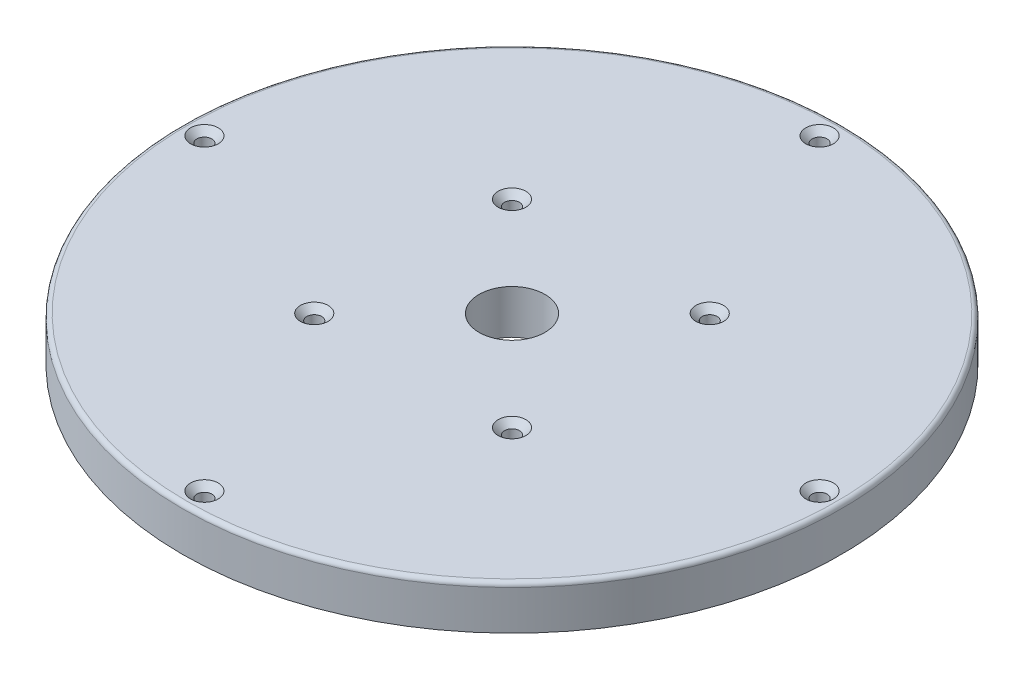
ISO-10303-21;
HEADER;
FILE_DESCRIPTION(('STEP AP214'),'2;1');
FILE_NAME('part.step','',(''),(''),'','','');
FILE_SCHEMA(('AUTOMOTIVE_DESIGN { 1 0 10303 214 1 1 1 1 }'));
ENDSEC;
DATA;
#1=APPLICATION_CONTEXT('core data for automotive mechanical design processes');
#2=APPLICATION_PROTOCOL_DEFINITION('international standard','automotive_design',2000,#1);
#3=PRODUCT_CONTEXT('',#1,'mechanical');
#4=PRODUCT('Part','Part','',(#3));
#5=PRODUCT_RELATED_PRODUCT_CATEGORY('part','',(#4));
#6=PRODUCT_DEFINITION_FORMATION('','',#4);
#7=PRODUCT_DEFINITION_CONTEXT('part definition',#1,'design');
#8=PRODUCT_DEFINITION('design','',#6,#7);
#9=PRODUCT_DEFINITION_SHAPE('','',#8);
#10=(LENGTH_UNIT() NAMED_UNIT(*) SI_UNIT(.MILLI.,.METRE.));
#11=(NAMED_UNIT(*) PLANE_ANGLE_UNIT() SI_UNIT($,.RADIAN.));
#12=(NAMED_UNIT(*) SI_UNIT($,.STERADIAN.) SOLID_ANGLE_UNIT());
#13=UNCERTAINTY_MEASURE_WITH_UNIT(LENGTH_MEASURE(1.E-05),#10,'distance_accuracy_value','');
#14=(GEOMETRIC_REPRESENTATION_CONTEXT(3) GLOBAL_UNCERTAINTY_ASSIGNED_CONTEXT((#13)) GLOBAL_UNIT_ASSIGNED_CONTEXT((#10,
#11,#12)) REPRESENTATION_CONTEXT('',''));
#15=CARTESIAN_POINT('',(0.,0.,0.));
#16=DIRECTION('',(0.,0.,1.));
#17=DIRECTION('',(1.,0.,0.));
#18=AXIS2_PLACEMENT_3D('',#15,#16,#17);
#19=CARTESIAN_POINT('',(0.,10.,0.));
#20=DIRECTION('',(0.,-1.,0.));
#21=DIRECTION('',(0.,0.,-1.));
#22=AXIS2_PLACEMENT_3D('',#19,#20,#21);
#23=CYLINDRICAL_SURFACE('',#22,75.);
#24=CARTESIAN_POINT('',(0.,9.,0.));
#25=DIRECTION('',(0.,1.,0.));
#26=DIRECTION('',(0.,0.,1.));
#27=AXIS2_PLACEMENT_3D('',#24,#25,#26);
#28=CIRCLE('',#27,75.);
#29=CARTESIAN_POINT('',(0.,9.,75.));
#30=VERTEX_POINT('',#29);
#31=EDGE_CURVE('E10',#30,#30,#28,.F.);
#32=ORIENTED_EDGE('',*,*,#31,.T.);
#33=EDGE_LOOP('',(#32));
#34=FACE_BOUND('',#33,.T.);
#35=CARTESIAN_POINT('',(0.,0.,0.));
#36=DIRECTION('',(0.,1.,0.));
#37=DIRECTION('',(0.,0.,1.));
#38=AXIS2_PLACEMENT_3D('',#35,#36,#37);
#39=CIRCLE('',#38,75.);
#40=CARTESIAN_POINT('',(0.,0.,75.));
#41=VERTEX_POINT('',#40);
#42=EDGE_CURVE('E45',#41,#41,#39,.T.);
#43=ORIENTED_EDGE('',*,*,#42,.T.);
#44=EDGE_LOOP('',(#43));
#45=FACE_BOUND('',#44,.T.);
#46=ADVANCED_FACE('F34',(#34,#45),#23,.T.);
#47=CARTESIAN_POINT('',(0.,10.,0.));
#48=DIRECTION('',(0.,1.,0.));
#49=DIRECTION('',(0.,0.,1.));
#50=AXIS2_PLACEMENT_3D('',#47,#48,#49);
#51=PLANE('',#50);
#52=CARTESIAN_POINT('',(0.,10.,0.));
#53=DIRECTION('',(0.,1.,0.));
#54=DIRECTION('',(0.,0.,1.));
#55=AXIS2_PLACEMENT_3D('',#52,#53,#54);
#56=CIRCLE('',#55,74.);
#57=CARTESIAN_POINT('',(0.,10.,74.));
#58=VERTEX_POINT('',#57);
#59=EDGE_CURVE('E41',#58,#58,#56,.T.);
#60=ORIENTED_EDGE('',*,*,#59,.T.);
#61=EDGE_LOOP('',(#60));
#62=FACE_BOUND('',#61,.T.);
#63=CARTESIAN_POINT('',(22.5,10.,-22.5));
#64=DIRECTION('',(0.,1.,0.));
#65=DIRECTION('',(0.,0.,1.));
#66=AXIS2_PLACEMENT_3D('',#63,#64,#65);
#67=CIRCLE('',#66,3.15);
#68=CARTESIAN_POINT('',(22.5,10.,-19.35));
#69=VERTEX_POINT('',#68);
#70=EDGE_CURVE('E126',#69,#69,#67,.T.);
#71=ORIENTED_EDGE('',*,*,#70,.F.);
#72=EDGE_LOOP('',(#71));
#73=FACE_BOUND('',#72,.T.);
#74=CARTESIAN_POINT('',(22.5,10.,22.5));
#75=DIRECTION('',(0.,1.,0.));
#76=DIRECTION('',(0.,0.,1.));
#77=AXIS2_PLACEMENT_3D('',#74,#75,#76);
#78=CIRCLE('',#77,3.15);
#79=CARTESIAN_POINT('',(22.5,10.,25.65));
#80=VERTEX_POINT('',#79);
#81=EDGE_CURVE('E117',#80,#80,#78,.T.);
#82=ORIENTED_EDGE('',*,*,#81,.F.);
#83=EDGE_LOOP('',(#82));
#84=FACE_BOUND('',#83,.T.);
#85=CARTESIAN_POINT('',(-22.5,10.,22.5));
#86=DIRECTION('',(0.,1.,0.));
#87=DIRECTION('',(0.,0.,1.));
#88=AXIS2_PLACEMENT_3D('',#85,#86,#87);
#89=CIRCLE('',#88,3.15);
#90=CARTESIAN_POINT('',(-22.5,10.,25.65));
#91=VERTEX_POINT('',#90);
#92=EDGE_CURVE('E108',#91,#91,#89,.T.);
#93=ORIENTED_EDGE('',*,*,#92,.F.);
#94=EDGE_LOOP('',(#93));
#95=FACE_BOUND('',#94,.T.);
#96=CARTESIAN_POINT('',(-22.5,10.,-22.5));
#97=DIRECTION('',(0.,1.,0.));
#98=DIRECTION('',(0.,0.,1.));
#99=AXIS2_PLACEMENT_3D('',#96,#97,#98);
#100=CIRCLE('',#99,3.15);
#101=CARTESIAN_POINT('',(-22.5,10.,-19.35));
#102=VERTEX_POINT('',#101);
#103=EDGE_CURVE('E99',#102,#102,#100,.T.);
#104=ORIENTED_EDGE('',*,*,#103,.F.);
#105=EDGE_LOOP('',(#104));
#106=FACE_BOUND('',#105,.T.);
#107=CARTESIAN_POINT('',(0.,10.,0.));
#108=DIRECTION('',(0.,1.,0.));
#109=DIRECTION('',(0.,0.,1.));
#110=AXIS2_PLACEMENT_3D('',#107,#108,#109);
#111=CIRCLE('',#110,7.5);
#112=CARTESIAN_POINT('',(0.,10.,7.5));
#113=VERTEX_POINT('',#112);
#114=EDGE_CURVE('E88',#113,#113,#111,.T.);
#115=ORIENTED_EDGE('',*,*,#114,.F.);
#116=EDGE_LOOP('',(#115));
#117=FACE_BOUND('',#116,.T.);
#118=CARTESIAN_POINT('',(70.,10.,-7.33211081157058E-13));
#119=DIRECTION('',(0.,1.,0.));
#120=DIRECTION('',(0.,0.,1.));
#121=AXIS2_PLACEMENT_3D('',#118,#119,#120);
#122=CIRCLE('',#121,3.15);
#123=CARTESIAN_POINT('',(70.,10.,3.14999999999927));
#124=VERTEX_POINT('',#123);
#125=EDGE_CURVE('E84',#124,#124,#122,.T.);
#126=ORIENTED_EDGE('',*,*,#125,.F.);
#127=EDGE_LOOP('',(#126));
#128=FACE_BOUND('',#127,.T.);
#129=CARTESIAN_POINT('',(0.,10.,70.));
#130=DIRECTION('',(0.,1.,0.));
#131=DIRECTION('',(0.,0.,1.));
#132=AXIS2_PLACEMENT_3D('',#129,#130,#131);
#133=CIRCLE('',#132,3.15);
#134=CARTESIAN_POINT('',(0.,10.,73.15));
#135=VERTEX_POINT('',#134);
#136=EDGE_CURVE('E75',#135,#135,#133,.T.);
#137=ORIENTED_EDGE('',*,*,#136,.F.);
#138=EDGE_LOOP('',(#137));
#139=FACE_BOUND('',#138,.T.);
#140=CARTESIAN_POINT('',(-70.,10.,2.44403693719019E-13));
#141=DIRECTION('',(0.,1.,0.));
#142=DIRECTION('',(0.,0.,1.));
#143=AXIS2_PLACEMENT_3D('',#140,#141,#142);
#144=CIRCLE('',#143,3.15);
#145=CARTESIAN_POINT('',(-70.,10.,3.15000000000024));
#146=VERTEX_POINT('',#145);
#147=EDGE_CURVE('E66',#146,#146,#144,.T.);
#148=ORIENTED_EDGE('',*,*,#147,.F.);
#149=EDGE_LOOP('',(#148));
#150=FACE_BOUND('',#149,.T.);
#151=CARTESIAN_POINT('',(0.,10.,-70.));
#152=DIRECTION('',(0.,1.,0.));
#153=DIRECTION('',(0.,0.,1.));
#154=AXIS2_PLACEMENT_3D('',#151,#152,#153);
#155=CIRCLE('',#154,3.15);
#156=CARTESIAN_POINT('',(0.,10.,-66.85));
#157=VERTEX_POINT('',#156);
#158=EDGE_CURVE('E57',#157,#157,#155,.T.);
#159=ORIENTED_EDGE('',*,*,#158,.F.);
#160=EDGE_LOOP('',(#159));
#161=FACE_BOUND('',#160,.T.);
#162=ADVANCED_FACE('F132',(#62,#73,#84,#95,#106,#117,#128,#139,#150,#161),#51,.T.);
#163=CARTESIAN_POINT('',(0.,0.,0.));
#164=DIRECTION('',(0.,1.,0.));
#165=DIRECTION('',(0.,0.,1.));
#166=AXIS2_PLACEMENT_3D('',#163,#164,#165);
#167=PLANE('',#166);
#168=CARTESIAN_POINT('',(22.5,0.,-22.5));
#169=DIRECTION('',(0.,1.,0.));
#170=DIRECTION('',(0.,0.,1.));
#171=AXIS2_PLACEMENT_3D('',#168,#169,#170);
#172=CIRCLE('',#171,1.69999999999999);
#173=CARTESIAN_POINT('',(22.5,0.,-20.8));
#174=VERTEX_POINT('',#173);
#175=EDGE_CURVE('E120',#174,#174,#172,.T.);
#176=ORIENTED_EDGE('',*,*,#175,.T.);
#177=EDGE_LOOP('',(#176));
#178=FACE_BOUND('',#177,.T.);
#179=CARTESIAN_POINT('',(22.5,0.,22.5));
#180=DIRECTION('',(0.,1.,0.));
#181=DIRECTION('',(0.,0.,1.));
#182=AXIS2_PLACEMENT_3D('',#179,#180,#181);
#183=CIRCLE('',#182,1.69999999999999);
#184=CARTESIAN_POINT('',(22.5,0.,24.2));
#185=VERTEX_POINT('',#184);
#186=EDGE_CURVE('E111',#185,#185,#183,.T.);
#187=ORIENTED_EDGE('',*,*,#186,.T.);
#188=EDGE_LOOP('',(#187));
#189=FACE_BOUND('',#188,.T.);
#190=CARTESIAN_POINT('',(-22.5,0.,22.5));
#191=DIRECTION('',(0.,1.,0.));
#192=DIRECTION('',(0.,0.,1.));
#193=AXIS2_PLACEMENT_3D('',#190,#191,#192);
#194=CIRCLE('',#193,1.69999999999999);
#195=CARTESIAN_POINT('',(-22.5,0.,24.2));
#196=VERTEX_POINT('',#195);
#197=EDGE_CURVE('E102',#196,#196,#194,.T.);
#198=ORIENTED_EDGE('',*,*,#197,.T.);
#199=EDGE_LOOP('',(#198));
#200=FACE_BOUND('',#199,.T.);
#201=CARTESIAN_POINT('',(-22.5,0.,-22.5));
#202=DIRECTION('',(0.,1.,0.));
#203=DIRECTION('',(0.,0.,1.));
#204=AXIS2_PLACEMENT_3D('',#201,#202,#203);
#205=CIRCLE('',#204,1.69999999999999);
#206=CARTESIAN_POINT('',(-22.5,0.,-20.8));
#207=VERTEX_POINT('',#206);
#208=EDGE_CURVE('E91',#207,#207,#205,.T.);
#209=ORIENTED_EDGE('',*,*,#208,.T.);
#210=EDGE_LOOP('',(#209));
#211=FACE_BOUND('',#210,.T.);
#212=CARTESIAN_POINT('',(0.,0.,0.));
#213=DIRECTION('',(0.,1.,0.));
#214=DIRECTION('',(0.,0.,1.));
#215=AXIS2_PLACEMENT_3D('',#212,#213,#214);
#216=CIRCLE('',#215,7.5);
#217=CARTESIAN_POINT('',(0.,0.,7.5));
#218=VERTEX_POINT('',#217);
#219=EDGE_CURVE('E87',#218,#218,#216,.T.);
#220=ORIENTED_EDGE('',*,*,#219,.T.);
#221=EDGE_LOOP('',(#220));
#222=FACE_BOUND('',#221,.T.);
#223=CARTESIAN_POINT('',(70.,0.,-7.33211081157058E-13));
#224=DIRECTION('',(0.,1.,0.));
#225=DIRECTION('',(0.,0.,1.));
#226=AXIS2_PLACEMENT_3D('',#223,#224,#225);
#227=CIRCLE('',#226,1.69999999999999);
#228=CARTESIAN_POINT('',(70.,0.,1.69999999999926));
#229=VERTEX_POINT('',#228);
#230=EDGE_CURVE('E78',#229,#229,#227,.T.);
#231=ORIENTED_EDGE('',*,*,#230,.T.);
#232=EDGE_LOOP('',(#231));
#233=FACE_BOUND('',#232,.T.);
#234=CARTESIAN_POINT('',(0.,0.,70.));
#235=DIRECTION('',(0.,1.,0.));
#236=DIRECTION('',(0.,0.,1.));
#237=AXIS2_PLACEMENT_3D('',#234,#235,#236);
#238=CIRCLE('',#237,1.7);
#239=CARTESIAN_POINT('',(0.,0.,71.7));
#240=VERTEX_POINT('',#239);
#241=EDGE_CURVE('E69',#240,#240,#238,.T.);
#242=ORIENTED_EDGE('',*,*,#241,.T.);
#243=EDGE_LOOP('',(#242));
#244=FACE_BOUND('',#243,.T.);
#245=CARTESIAN_POINT('',(-70.,0.,2.44403693719019E-13));
#246=DIRECTION('',(0.,1.,0.));
#247=DIRECTION('',(0.,0.,1.));
#248=AXIS2_PLACEMENT_3D('',#245,#246,#247);
#249=CIRCLE('',#248,1.69999999999999);
#250=CARTESIAN_POINT('',(-70.,0.,1.70000000000024));
#251=VERTEX_POINT('',#250);
#252=EDGE_CURVE('E60',#251,#251,#249,.T.);
#253=ORIENTED_EDGE('',*,*,#252,.T.);
#254=EDGE_LOOP('',(#253));
#255=FACE_BOUND('',#254,.T.);
#256=CARTESIAN_POINT('',(0.,0.,-70.));
#257=DIRECTION('',(0.,1.,0.));
#258=DIRECTION('',(0.,0.,1.));
#259=AXIS2_PLACEMENT_3D('',#256,#257,#258);
#260=CIRCLE('',#259,1.7);
#261=CARTESIAN_POINT('',(0.,0.,-68.3));
#262=VERTEX_POINT('',#261);
#263=EDGE_CURVE('E49',#262,#262,#260,.T.);
#264=ORIENTED_EDGE('',*,*,#263,.T.);
#265=EDGE_LOOP('',(#264));
#266=FACE_BOUND('',#265,.T.);
#267=ORIENTED_EDGE('',*,*,#42,.F.);
#268=EDGE_LOOP('',(#267));
#269=FACE_BOUND('',#268,.T.);
#270=ADVANCED_FACE('F135',(#178,#189,#200,#211,#222,#233,#244,#255,#266,#269),#167,.F.);
#271=CARTESIAN_POINT('',(0.,10.,-70.));
#272=DIRECTION('',(0.,1.,0.));
#273=DIRECTION('',(0.,0.,1.));
#274=AXIS2_PLACEMENT_3D('',#271,#272,#273);
#275=CYLINDRICAL_SURFACE('',#274,1.7);
#276=ORIENTED_EDGE('',*,*,#263,.F.);
#277=EDGE_LOOP('',(#276));
#278=FACE_BOUND('',#277,.T.);
#279=CARTESIAN_POINT('',(0.,8.55,-70.));
#280=DIRECTION('',(0.,1.,0.));
#281=DIRECTION('',(0.,0.,1.));
#282=AXIS2_PLACEMENT_3D('',#279,#280,#281);
#283=CIRCLE('',#282,1.7);
#284=CARTESIAN_POINT('',(0.,8.55,-68.3));
#285=VERTEX_POINT('',#284);
#286=EDGE_CURVE('E54',#285,#285,#283,.T.);
#287=ORIENTED_EDGE('',*,*,#286,.T.);
#288=EDGE_LOOP('',(#287));
#289=FACE_BOUND('',#288,.T.);
#290=ADVANCED_FACE('F156',(#278,#289),#275,.F.);
#291=CARTESIAN_POINT('',(0.,10.,-70.));
#292=DIRECTION('',(0.,1.,0.));
#293=DIRECTION('',(0.,0.,1.));
#294=AXIS2_PLACEMENT_3D('',#291,#292,#293);
#295=CONICAL_SURFACE('',#294,3.15,0.785398163397448);
#296=ORIENTED_EDGE('',*,*,#286,.F.);
#297=EDGE_LOOP('',(#296));
#298=FACE_BOUND('',#297,.T.);
#299=ORIENTED_EDGE('',*,*,#158,.T.);
#300=EDGE_LOOP('',(#299));
#301=FACE_BOUND('',#300,.T.);
#302=ADVANCED_FACE('F153',(#298,#301),#295,.F.);
#303=CARTESIAN_POINT('',(-70.,10.,2.44403693719019E-13));
#304=DIRECTION('',(0.,1.,0.));
#305=DIRECTION('',(0.,0.,1.));
#306=AXIS2_PLACEMENT_3D('',#303,#304,#305);
#307=CYLINDRICAL_SURFACE('',#306,1.69999999999999);
#308=ORIENTED_EDGE('',*,*,#252,.F.);
#309=EDGE_LOOP('',(#308));
#310=FACE_BOUND('',#309,.T.);
#311=CARTESIAN_POINT('',(-70.,8.55,2.44403693719019E-13));
#312=DIRECTION('',(0.,1.,0.));
#313=DIRECTION('',(0.,0.,1.));
#314=AXIS2_PLACEMENT_3D('',#311,#312,#313);
#315=CIRCLE('',#314,1.69999999999999);
#316=CARTESIAN_POINT('',(-70.,8.55,1.70000000000024));
#317=VERTEX_POINT('',#316);
#318=EDGE_CURVE('E63',#317,#317,#315,.T.);
#319=ORIENTED_EDGE('',*,*,#318,.T.);
#320=EDGE_LOOP('',(#319));
#321=FACE_BOUND('',#320,.T.);
#322=ADVANCED_FACE('F155',(#310,#321),#307,.F.);
#323=CARTESIAN_POINT('',(-70.,10.,2.44403693719019E-13));
#324=DIRECTION('',(0.,1.,0.));
#325=DIRECTION('',(0.,0.,1.));
#326=AXIS2_PLACEMENT_3D('',#323,#324,#325);
#327=CONICAL_SURFACE('',#326,3.15,0.78539816339745);
#328=ORIENTED_EDGE('',*,*,#318,.F.);
#329=EDGE_LOOP('',(#328));
#330=FACE_BOUND('',#329,.T.);
#331=ORIENTED_EDGE('',*,*,#147,.T.);
#332=EDGE_LOOP('',(#331));
#333=FACE_BOUND('',#332,.T.);
#334=ADVANCED_FACE('F163',(#330,#333),#327,.F.);
#335=CARTESIAN_POINT('',(0.,10.,70.));
#336=DIRECTION('',(0.,1.,0.));
#337=DIRECTION('',(0.,0.,1.));
#338=AXIS2_PLACEMENT_3D('',#335,#336,#337);
#339=CYLINDRICAL_SURFACE('',#338,1.7);
#340=ORIENTED_EDGE('',*,*,#241,.F.);
#341=EDGE_LOOP('',(#340));
#342=FACE_BOUND('',#341,.T.);
#343=CARTESIAN_POINT('',(0.,8.55,70.));
#344=DIRECTION('',(0.,1.,0.));
#345=DIRECTION('',(0.,0.,1.));
#346=AXIS2_PLACEMENT_3D('',#343,#344,#345);
#347=CIRCLE('',#346,1.7);
#348=CARTESIAN_POINT('',(0.,8.55,71.7));
#349=VERTEX_POINT('',#348);
#350=EDGE_CURVE('E72',#349,#349,#347,.T.);
#351=ORIENTED_EDGE('',*,*,#350,.T.);
#352=EDGE_LOOP('',(#351));
#353=FACE_BOUND('',#352,.T.);
#354=ADVANCED_FACE('F203',(#342,#353),#339,.F.);
#355=CARTESIAN_POINT('',(0.,10.,70.));
#356=DIRECTION('',(0.,1.,0.));
#357=DIRECTION('',(0.,0.,1.));
#358=AXIS2_PLACEMENT_3D('',#355,#356,#357);
#359=CONICAL_SURFACE('',#358,3.15,0.785398163397448);
#360=ORIENTED_EDGE('',*,*,#350,.F.);
#361=EDGE_LOOP('',(#360));
#362=FACE_BOUND('',#361,.T.);
#363=ORIENTED_EDGE('',*,*,#136,.T.);
#364=EDGE_LOOP('',(#363));
#365=FACE_BOUND('',#364,.T.);
#366=ADVANCED_FACE('F208',(#362,#365),#359,.F.);
#367=CARTESIAN_POINT('',(70.,10.,-7.33211081157058E-13));
#368=DIRECTION('',(0.,1.,0.));
#369=DIRECTION('',(0.,0.,1.));
#370=AXIS2_PLACEMENT_3D('',#367,#368,#369);
#371=CYLINDRICAL_SURFACE('',#370,1.69999999999999);
#372=ORIENTED_EDGE('',*,*,#230,.F.);
#373=EDGE_LOOP('',(#372));
#374=FACE_BOUND('',#373,.T.);
#375=CARTESIAN_POINT('',(70.,8.55,-7.33211081157058E-13));
#376=DIRECTION('',(0.,1.,0.));
#377=DIRECTION('',(0.,0.,1.));
#378=AXIS2_PLACEMENT_3D('',#375,#376,#377);
#379=CIRCLE('',#378,1.69999999999999);
#380=CARTESIAN_POINT('',(70.,8.55,1.69999999999926));
#381=VERTEX_POINT('',#380);
#382=EDGE_CURVE('E81',#381,#381,#379,.T.);
#383=ORIENTED_EDGE('',*,*,#382,.T.);
#384=EDGE_LOOP('',(#383));
#385=FACE_BOUND('',#384,.T.);
#386=ADVANCED_FACE('F214',(#374,#385),#371,.F.);
#387=CARTESIAN_POINT('',(70.,10.,-7.33211081157058E-13));
#388=DIRECTION('',(0.,1.,0.));
#389=DIRECTION('',(0.,0.,1.));
#390=AXIS2_PLACEMENT_3D('',#387,#388,#389);
#391=CONICAL_SURFACE('',#390,3.15,0.78539816339745);
#392=ORIENTED_EDGE('',*,*,#382,.F.);
#393=EDGE_LOOP('',(#392));
#394=FACE_BOUND('',#393,.T.);
#395=ORIENTED_EDGE('',*,*,#125,.T.);
#396=EDGE_LOOP('',(#395));
#397=FACE_BOUND('',#396,.T.);
#398=ADVANCED_FACE('F218',(#394,#397),#391,.F.);
#399=CARTESIAN_POINT('',(0.,0.,0.));
#400=DIRECTION('',(0.,1.,0.));
#401=DIRECTION('',(0.,0.,1.));
#402=AXIS2_PLACEMENT_3D('',#399,#400,#401);
#403=CYLINDRICAL_SURFACE('',#402,7.5);
#404=ORIENTED_EDGE('',*,*,#219,.F.);
#405=EDGE_LOOP('',(#404));
#406=FACE_BOUND('',#405,.T.);
#407=ORIENTED_EDGE('',*,*,#114,.T.);
#408=EDGE_LOOP('',(#407));
#409=FACE_BOUND('',#408,.T.);
#410=ADVANCED_FACE('F222',(#406,#409),#403,.F.);
#411=CARTESIAN_POINT('',(-22.5,10.,-22.5));
#412=DIRECTION('',(0.,1.,0.));
#413=DIRECTION('',(0.,0.,1.));
#414=AXIS2_PLACEMENT_3D('',#411,#412,#413);
#415=CYLINDRICAL_SURFACE('',#414,1.69999999999999);
#416=ORIENTED_EDGE('',*,*,#208,.F.);
#417=EDGE_LOOP('',(#416));
#418=FACE_BOUND('',#417,.T.);
#419=CARTESIAN_POINT('',(-22.5,8.54999999999999,-22.5));
#420=DIRECTION('',(0.,1.,0.));
#421=DIRECTION('',(0.,0.,1.));
#422=AXIS2_PLACEMENT_3D('',#419,#420,#421);
#423=CIRCLE('',#422,1.69999999999999);
#424=CARTESIAN_POINT('',(-22.5,8.54999999999999,-20.8));
#425=VERTEX_POINT('',#424);
#426=EDGE_CURVE('E96',#425,#425,#423,.T.);
#427=ORIENTED_EDGE('',*,*,#426,.T.);
#428=EDGE_LOOP('',(#427));
#429=FACE_BOUND('',#428,.T.);
#430=ADVANCED_FACE('F226',(#418,#429),#415,.F.);
#431=CARTESIAN_POINT('',(-22.5,10.,-22.5));
#432=DIRECTION('',(0.,1.,0.));
#433=DIRECTION('',(0.,0.,1.));
#434=AXIS2_PLACEMENT_3D('',#431,#432,#433);
#435=CONICAL_SURFACE('',#434,3.15,0.78539816339745);
#436=ORIENTED_EDGE('',*,*,#426,.F.);
#437=EDGE_LOOP('',(#436));
#438=FACE_BOUND('',#437,.T.);
#439=ORIENTED_EDGE('',*,*,#103,.T.);
#440=EDGE_LOOP('',(#439));
#441=FACE_BOUND('',#440,.T.);
#442=ADVANCED_FACE('F230',(#438,#441),#435,.F.);
#443=CARTESIAN_POINT('',(-22.5,10.,22.5));
#444=DIRECTION('',(0.,1.,0.));
#445=DIRECTION('',(0.,0.,1.));
#446=AXIS2_PLACEMENT_3D('',#443,#444,#445);
#447=CYLINDRICAL_SURFACE('',#446,1.69999999999999);
#448=ORIENTED_EDGE('',*,*,#197,.F.);
#449=EDGE_LOOP('',(#448));
#450=FACE_BOUND('',#449,.T.);
#451=CARTESIAN_POINT('',(-22.5,8.54999999999999,22.5));
#452=DIRECTION('',(0.,1.,0.));
#453=DIRECTION('',(0.,0.,1.));
#454=AXIS2_PLACEMENT_3D('',#451,#452,#453);
#455=CIRCLE('',#454,1.69999999999999);
#456=CARTESIAN_POINT('',(-22.5,8.54999999999999,24.2));
#457=VERTEX_POINT('',#456);
#458=EDGE_CURVE('E105',#457,#457,#455,.T.);
#459=ORIENTED_EDGE('',*,*,#458,.T.);
#460=EDGE_LOOP('',(#459));
#461=FACE_BOUND('',#460,.T.);
#462=ADVANCED_FACE('F234',(#450,#461),#447,.F.);
#463=CARTESIAN_POINT('',(-22.5,10.,22.5));
#464=DIRECTION('',(0.,1.,0.));
#465=DIRECTION('',(0.,0.,1.));
#466=AXIS2_PLACEMENT_3D('',#463,#464,#465);
#467=CONICAL_SURFACE('',#466,3.15,0.78539816339745);
#468=ORIENTED_EDGE('',*,*,#458,.F.);
#469=EDGE_LOOP('',(#468));
#470=FACE_BOUND('',#469,.T.);
#471=ORIENTED_EDGE('',*,*,#92,.T.);
#472=EDGE_LOOP('',(#471));
#473=FACE_BOUND('',#472,.T.);
#474=ADVANCED_FACE('F238',(#470,#473),#467,.F.);
#475=CARTESIAN_POINT('',(22.5,10.,22.5));
#476=DIRECTION('',(0.,1.,0.));
#477=DIRECTION('',(0.,0.,1.));
#478=AXIS2_PLACEMENT_3D('',#475,#476,#477);
#479=CYLINDRICAL_SURFACE('',#478,1.69999999999999);
#480=ORIENTED_EDGE('',*,*,#186,.F.);
#481=EDGE_LOOP('',(#480));
#482=FACE_BOUND('',#481,.T.);
#483=CARTESIAN_POINT('',(22.5,8.54999999999999,22.5));
#484=DIRECTION('',(0.,1.,0.));
#485=DIRECTION('',(0.,0.,1.));
#486=AXIS2_PLACEMENT_3D('',#483,#484,#485);
#487=CIRCLE('',#486,1.69999999999999);
#488=CARTESIAN_POINT('',(22.5,8.54999999999999,24.2));
#489=VERTEX_POINT('',#488);
#490=EDGE_CURVE('E114',#489,#489,#487,.T.);
#491=ORIENTED_EDGE('',*,*,#490,.T.);
#492=EDGE_LOOP('',(#491));
#493=FACE_BOUND('',#492,.T.);
#494=ADVANCED_FACE('F242',(#482,#493),#479,.F.);
#495=CARTESIAN_POINT('',(22.5,10.,22.5));
#496=DIRECTION('',(0.,1.,0.));
#497=DIRECTION('',(0.,0.,1.));
#498=AXIS2_PLACEMENT_3D('',#495,#496,#497);
#499=CONICAL_SURFACE('',#498,3.15,0.78539816339745);
#500=ORIENTED_EDGE('',*,*,#490,.F.);
#501=EDGE_LOOP('',(#500));
#502=FACE_BOUND('',#501,.T.);
#503=ORIENTED_EDGE('',*,*,#81,.T.);
#504=EDGE_LOOP('',(#503));
#505=FACE_BOUND('',#504,.T.);
#506=ADVANCED_FACE('F246',(#502,#505),#499,.F.);
#507=CARTESIAN_POINT('',(22.5,10.,-22.5));
#508=DIRECTION('',(0.,1.,0.));
#509=DIRECTION('',(0.,0.,1.));
#510=AXIS2_PLACEMENT_3D('',#507,#508,#509);
#511=CYLINDRICAL_SURFACE('',#510,1.69999999999999);
#512=ORIENTED_EDGE('',*,*,#175,.F.);
#513=EDGE_LOOP('',(#512));
#514=FACE_BOUND('',#513,.T.);
#515=CARTESIAN_POINT('',(22.5,8.54999999999999,-22.5));
#516=DIRECTION('',(0.,1.,0.));
#517=DIRECTION('',(0.,0.,1.));
#518=AXIS2_PLACEMENT_3D('',#515,#516,#517);
#519=CIRCLE('',#518,1.69999999999999);
#520=CARTESIAN_POINT('',(22.5,8.54999999999999,-20.8));
#521=VERTEX_POINT('',#520);
#522=EDGE_CURVE('E123',#521,#521,#519,.T.);
#523=ORIENTED_EDGE('',*,*,#522,.T.);
#524=EDGE_LOOP('',(#523));
#525=FACE_BOUND('',#524,.T.);
#526=ADVANCED_FACE('F250',(#514,#525),#511,.F.);
#527=CARTESIAN_POINT('',(22.5,10.,-22.5));
#528=DIRECTION('',(0.,1.,0.));
#529=DIRECTION('',(0.,0.,1.));
#530=AXIS2_PLACEMENT_3D('',#527,#528,#529);
#531=CONICAL_SURFACE('',#530,3.15,0.78539816339745);
#532=ORIENTED_EDGE('',*,*,#522,.F.);
#533=EDGE_LOOP('',(#532));
#534=FACE_BOUND('',#533,.T.);
#535=ORIENTED_EDGE('',*,*,#70,.T.);
#536=EDGE_LOOP('',(#535));
#537=FACE_BOUND('',#536,.T.);
#538=ADVANCED_FACE('F130',(#534,#537),#531,.F.);
#539=CARTESIAN_POINT('',(0.,9.,0.));
#540=DIRECTION('',(0.,1.,0.));
#541=DIRECTION('',(0.,0.,1.));
#542=AXIS2_PLACEMENT_3D('',#539,#540,#541);
#543=TOROIDAL_SURFACE('',#542,74.,1.);
#544=ORIENTED_EDGE('',*,*,#31,.F.);
#545=EDGE_LOOP('',(#544));
#546=FACE_BOUND('',#545,.T.);
#547=ORIENTED_EDGE('',*,*,#59,.F.);
#548=EDGE_LOOP('',(#547));
#549=FACE_BOUND('',#548,.T.);
#550=ADVANCED_FACE('F36',(#546,#549),#543,.T.);
#551=CLOSED_SHELL('',(#46,#162,#270,#290,#302,#322,#334,#354,#366,#386,#398,#410,#430,#442,#462,
#474,#494,#506,#526,#538,#550));
#552=MANIFOLD_SOLID_BREP('B2',#551);
#553=ADVANCED_BREP_SHAPE_REPRESENTATION('',(#18,#552),#14);
#554=SHAPE_DEFINITION_REPRESENTATION(#9,#553);
ENDSEC;
END-ISO-10303-21;
